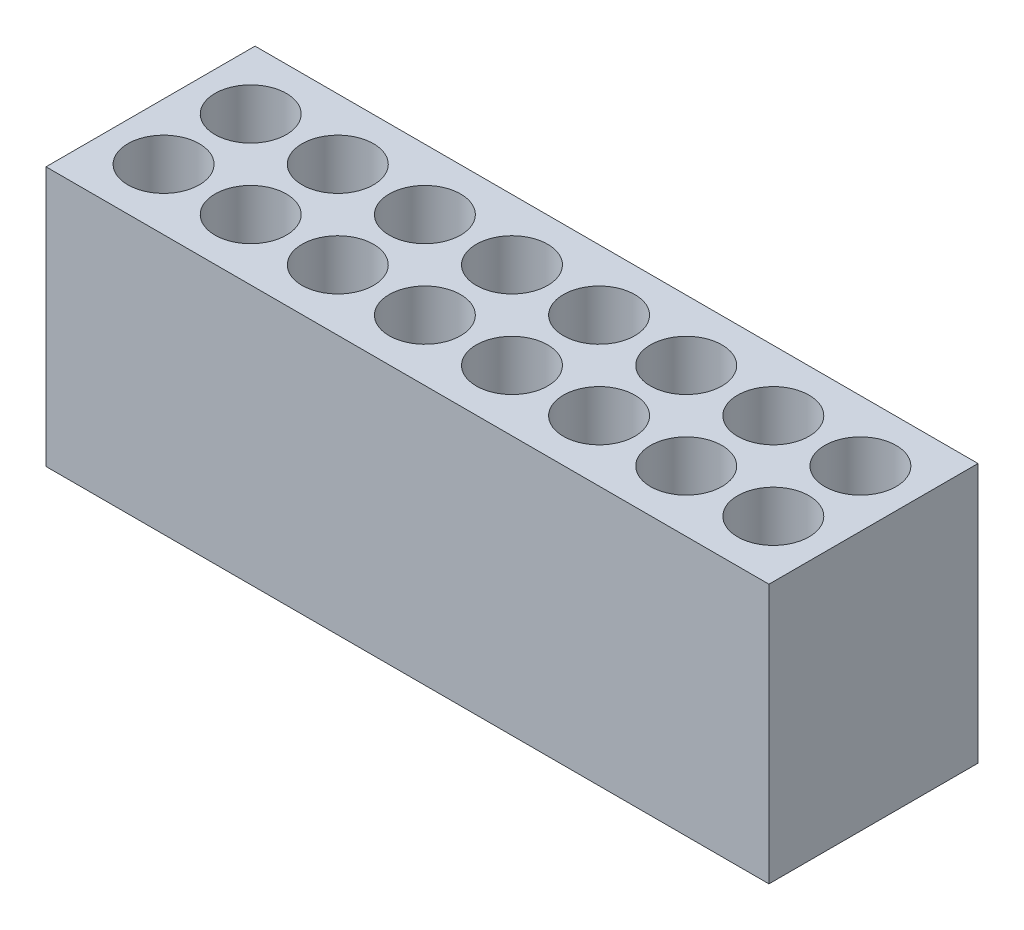
ISO-10303-21;
HEADER;
FILE_DESCRIPTION(('STEP AP214'),'2;1');
FILE_NAME('part.step','',(''),(''),'','','');
FILE_SCHEMA(('AUTOMOTIVE_DESIGN { 1 0 10303 214 1 1 1 1 }'));
ENDSEC;
DATA;
#1=APPLICATION_CONTEXT('core data for automotive mechanical design processes');
#2=APPLICATION_PROTOCOL_DEFINITION('international standard','automotive_design',2000,#1);
#3=PRODUCT_CONTEXT('',#1,'mechanical');
#4=PRODUCT('Part','Part','',(#3));
#5=PRODUCT_RELATED_PRODUCT_CATEGORY('part','',(#4));
#6=PRODUCT_DEFINITION_FORMATION('','',#4);
#7=PRODUCT_DEFINITION_CONTEXT('part definition',#1,'design');
#8=PRODUCT_DEFINITION('design','',#6,#7);
#9=PRODUCT_DEFINITION_SHAPE('','',#8);
#10=(LENGTH_UNIT() NAMED_UNIT(*) SI_UNIT(.MILLI.,.METRE.));
#11=(NAMED_UNIT(*) PLANE_ANGLE_UNIT() SI_UNIT($,.RADIAN.));
#12=(NAMED_UNIT(*) SI_UNIT($,.STERADIAN.) SOLID_ANGLE_UNIT());
#13=UNCERTAINTY_MEASURE_WITH_UNIT(LENGTH_MEASURE(1.E-05),#10,'distance_accuracy_value','');
#14=(GEOMETRIC_REPRESENTATION_CONTEXT(3) GLOBAL_UNCERTAINTY_ASSIGNED_CONTEXT((#13)) GLOBAL_UNIT_ASSIGNED_CONTEXT((#10,
#11,#12)) REPRESENTATION_CONTEXT('',''));
#15=CARTESIAN_POINT('',(0.,0.,0.));
#16=DIRECTION('',(0.,0.,1.));
#17=DIRECTION('',(1.,0.,0.));
#18=AXIS2_PLACEMENT_3D('',#15,#16,#17);
#19=CARTESIAN_POINT('',(0.,-3.7846,-3.048));
#20=DIRECTION('',(-1.,0.,0.));
#21=DIRECTION('',(0.,0.,1.));
#22=AXIS2_PLACEMENT_3D('',#19,#20,#21);
#23=PLANE('',#22);
#24=DIRECTION('',(0.,0.,1.));
#25=VECTOR('',#24,1.);
#26=CARTESIAN_POINT('',(0.,0.,-3.048));
#27=LINE('',#26,#25);
#28=CARTESIAN_POINT('',(0.,0.,-3.048));
#29=VERTEX_POINT('',#28);
#30=CARTESIAN_POINT('',(0.,0.,0.));
#31=VERTEX_POINT('',#30);
#32=EDGE_CURVE('E82',#29,#31,#27,.T.);
#33=ORIENTED_EDGE('',*,*,#32,.F.);
#34=DIRECTION('',(0.,1.,0.));
#35=VECTOR('',#34,1.);
#36=CARTESIAN_POINT('',(0.,-3.7846,-3.048));
#37=LINE('',#36,#35);
#38=CARTESIAN_POINT('',(0.,-3.7846,-3.048));
#39=VERTEX_POINT('',#38);
#40=EDGE_CURVE('E11',#39,#29,#37,.T.);
#41=ORIENTED_EDGE('',*,*,#40,.F.);
#42=DIRECTION('',(0.,0.,1.));
#43=VECTOR('',#42,1.);
#44=CARTESIAN_POINT('',(0.,-3.7846,-3.048));
#45=LINE('',#44,#43);
#46=CARTESIAN_POINT('',(0.,-3.7846,0.));
#47=VERTEX_POINT('',#46);
#48=EDGE_CURVE('E75',#39,#47,#45,.T.);
#49=ORIENTED_EDGE('',*,*,#48,.T.);
#50=DIRECTION('',(0.,1.,0.));
#51=VECTOR('',#50,1.);
#52=CARTESIAN_POINT('',(0.,-3.7846,0.));
#53=LINE('',#52,#51);
#54=EDGE_CURVE('E20',#47,#31,#53,.T.);
#55=ORIENTED_EDGE('',*,*,#54,.T.);
#56=EDGE_LOOP('',(#33,#41,#49,#55));
#57=FACE_BOUND('',#56,.T.);
#58=ADVANCED_FACE('F17',(#57),#23,.T.);
#59=CARTESIAN_POINT('',(10.541,-3.7846,-3.04799999999999));
#60=DIRECTION('',(0.,0.,-1.));
#61=DIRECTION('',(-1.,0.,0.));
#62=AXIS2_PLACEMENT_3D('',#59,#60,#61);
#63=PLANE('',#62);
#64=DIRECTION('',(-1.,0.,0.));
#65=VECTOR('',#64,1.);
#66=CARTESIAN_POINT('',(10.541,0.,-3.04799999999999));
#67=LINE('',#66,#65);
#68=CARTESIAN_POINT('',(10.541,0.,-3.04799999999999));
#69=VERTEX_POINT('',#68);
#70=EDGE_CURVE('E77',#69,#29,#67,.T.);
#71=ORIENTED_EDGE('',*,*,#70,.F.);
#72=DIRECTION('',(0.,1.,0.));
#73=VECTOR('',#72,1.);
#74=CARTESIAN_POINT('',(10.541,-3.7846,-3.04799999999999));
#75=LINE('',#74,#73);
#76=CARTESIAN_POINT('',(10.541,-3.7846,-3.04799999999999));
#77=VERTEX_POINT('',#76);
#78=EDGE_CURVE('E26',#77,#69,#75,.T.);
#79=ORIENTED_EDGE('',*,*,#78,.F.);
#80=DIRECTION('',(-1.,0.,0.));
#81=VECTOR('',#80,1.);
#82=CARTESIAN_POINT('',(10.541,-3.7846,-3.04799999999999));
#83=LINE('',#82,#81);
#84=EDGE_CURVE('E72',#77,#39,#83,.T.);
#85=ORIENTED_EDGE('',*,*,#84,.T.);
#86=ORIENTED_EDGE('',*,*,#40,.T.);
#87=EDGE_LOOP('',(#71,#79,#85,#86));
#88=FACE_BOUND('',#87,.T.);
#89=ADVANCED_FACE('F93',(#88),#63,.T.);
#90=CARTESIAN_POINT('',(10.541,-3.7846,0.));
#91=DIRECTION('',(1.,0.,0.));
#92=DIRECTION('',(0.,0.,-1.));
#93=AXIS2_PLACEMENT_3D('',#90,#91,#92);
#94=PLANE('',#93);
#95=DIRECTION('',(0.,0.,-1.));
#96=VECTOR('',#95,1.);
#97=CARTESIAN_POINT('',(10.541,0.,0.));
#98=LINE('',#97,#96);
#99=CARTESIAN_POINT('',(10.541,0.,0.));
#100=VERTEX_POINT('',#99);
#101=EDGE_CURVE('E67',#100,#69,#98,.T.);
#102=ORIENTED_EDGE('',*,*,#101,.F.);
#103=DIRECTION('',(0.,1.,0.));
#104=VECTOR('',#103,1.);
#105=CARTESIAN_POINT('',(10.541,-3.7846,0.));
#106=LINE('',#105,#104);
#107=CARTESIAN_POINT('',(10.541,-3.7846,0.));
#108=VERTEX_POINT('',#107);
#109=EDGE_CURVE('E62',#108,#100,#106,.T.);
#110=ORIENTED_EDGE('',*,*,#109,.F.);
#111=DIRECTION('',(0.,0.,-1.));
#112=VECTOR('',#111,1.);
#113=CARTESIAN_POINT('',(10.541,-3.7846,0.));
#114=LINE('',#113,#112);
#115=EDGE_CURVE('E65',#108,#77,#114,.T.);
#116=ORIENTED_EDGE('',*,*,#115,.T.);
#117=ORIENTED_EDGE('',*,*,#78,.T.);
#118=EDGE_LOOP('',(#102,#110,#116,#117));
#119=FACE_BOUND('',#118,.T.);
#120=ADVANCED_FACE('F64',(#119),#94,.T.);
#121=CARTESIAN_POINT('',(0.,-3.7846,0.));
#122=DIRECTION('',(0.,0.,1.));
#123=DIRECTION('',(1.,0.,0.));
#124=AXIS2_PLACEMENT_3D('',#121,#122,#123);
#125=PLANE('',#124);
#126=DIRECTION('',(1.,0.,0.));
#127=VECTOR('',#126,1.);
#128=CARTESIAN_POINT('',(0.,0.,0.));
#129=LINE('',#128,#127);
#130=EDGE_CURVE('E85',#31,#100,#129,.T.);
#131=ORIENTED_EDGE('',*,*,#130,.F.);
#132=ORIENTED_EDGE('',*,*,#54,.F.);
#133=DIRECTION('',(1.,0.,0.));
#134=VECTOR('',#133,1.);
#135=CARTESIAN_POINT('',(0.,-3.7846,0.));
#136=LINE('',#135,#134);
#137=EDGE_CURVE('E71',#47,#108,#136,.T.);
#138=ORIENTED_EDGE('',*,*,#137,.T.);
#139=ORIENTED_EDGE('',*,*,#109,.T.);
#140=EDGE_LOOP('',(#131,#132,#138,#139));
#141=FACE_BOUND('',#140,.T.);
#142=ADVANCED_FACE('F74',(#141),#125,.T.);
#143=CARTESIAN_POINT('',(0.,-3.7846,0.));
#144=DIRECTION('',(0.,1.,0.));
#145=DIRECTION('',(0.,0.,1.));
#146=AXIS2_PLACEMENT_3D('',#143,#144,#145);
#147=PLANE('',#146);
#148=CARTESIAN_POINT('',(9.7155,-3.7846,-2.159));
#149=DIRECTION('',(0.,1.,0.));
#150=DIRECTION('',(0.,0.,1.));
#151=AXIS2_PLACEMENT_3D('',#148,#149,#150);
#152=CIRCLE('',#151,0.520700000000013);
#153=CARTESIAN_POINT('',(9.7155,-3.7846,-1.63829999999999));
#154=VERTEX_POINT('',#153);
#155=EDGE_CURVE('E183',#154,#154,#152,.T.);
#156=ORIENTED_EDGE('',*,*,#155,.T.);
#157=EDGE_LOOP('',(#156));
#158=FACE_BOUND('',#157,.T.);
#159=CARTESIAN_POINT('',(8.4455,-3.7846,-2.159));
#160=DIRECTION('',(0.,1.,0.));
#161=DIRECTION('',(0.,0.,1.));
#162=AXIS2_PLACEMENT_3D('',#159,#160,#161);
#163=CIRCLE('',#162,0.520700000000013);
#164=CARTESIAN_POINT('',(8.4455,-3.7846,-1.63829999999999));
#165=VERTEX_POINT('',#164);
#166=EDGE_CURVE('E187',#165,#165,#163,.T.);
#167=ORIENTED_EDGE('',*,*,#166,.T.);
#168=EDGE_LOOP('',(#167));
#169=FACE_BOUND('',#168,.T.);
#170=CARTESIAN_POINT('',(7.1755,-3.7846,-2.159));
#171=DIRECTION('',(0.,1.,0.));
#172=DIRECTION('',(0.,0.,1.));
#173=AXIS2_PLACEMENT_3D('',#170,#171,#172);
#174=CIRCLE('',#173,0.520700000000013);
#175=CARTESIAN_POINT('',(7.1755,-3.7846,-1.63829999999999));
#176=VERTEX_POINT('',#175);
#177=EDGE_CURVE('E196',#176,#176,#174,.T.);
#178=ORIENTED_EDGE('',*,*,#177,.T.);
#179=EDGE_LOOP('',(#178));
#180=FACE_BOUND('',#179,.T.);
#181=CARTESIAN_POINT('',(5.9055,-3.7846,-2.159));
#182=DIRECTION('',(0.,1.,0.));
#183=DIRECTION('',(0.,0.,1.));
#184=AXIS2_PLACEMENT_3D('',#181,#182,#183);
#185=CIRCLE('',#184,0.520700000000013);
#186=CARTESIAN_POINT('',(5.9055,-3.7846,-1.63829999999999));
#187=VERTEX_POINT('',#186);
#188=EDGE_CURVE('E202',#187,#187,#185,.T.);
#189=ORIENTED_EDGE('',*,*,#188,.T.);
#190=EDGE_LOOP('',(#189));
#191=FACE_BOUND('',#190,.T.);
#192=CARTESIAN_POINT('',(4.6355,-3.7846,-2.159));
#193=DIRECTION('',(0.,1.,0.));
#194=DIRECTION('',(0.,0.,1.));
#195=AXIS2_PLACEMENT_3D('',#192,#193,#194);
#196=CIRCLE('',#195,0.520700000000013);
#197=CARTESIAN_POINT('',(4.6355,-3.7846,-1.63829999999999));
#198=VERTEX_POINT('',#197);
#199=EDGE_CURVE('E208',#198,#198,#196,.T.);
#200=ORIENTED_EDGE('',*,*,#199,.T.);
#201=EDGE_LOOP('',(#200));
#202=FACE_BOUND('',#201,.T.);
#203=CARTESIAN_POINT('',(3.3655,-3.7846,-2.159));
#204=DIRECTION('',(0.,1.,0.));
#205=DIRECTION('',(0.,0.,1.));
#206=AXIS2_PLACEMENT_3D('',#203,#204,#205);
#207=CIRCLE('',#206,0.520700000000013);
#208=CARTESIAN_POINT('',(3.3655,-3.7846,-1.63829999999999));
#209=VERTEX_POINT('',#208);
#210=EDGE_CURVE('E214',#209,#209,#207,.T.);
#211=ORIENTED_EDGE('',*,*,#210,.T.);
#212=EDGE_LOOP('',(#211));
#213=FACE_BOUND('',#212,.T.);
#214=CARTESIAN_POINT('',(2.0955,-3.7846,-2.159));
#215=DIRECTION('',(0.,1.,0.));
#216=DIRECTION('',(0.,0.,1.));
#217=AXIS2_PLACEMENT_3D('',#214,#215,#216);
#218=CIRCLE('',#217,0.520700000000013);
#219=CARTESIAN_POINT('',(2.0955,-3.7846,-1.63829999999999));
#220=VERTEX_POINT('',#219);
#221=EDGE_CURVE('E220',#220,#220,#218,.T.);
#222=ORIENTED_EDGE('',*,*,#221,.T.);
#223=EDGE_LOOP('',(#222));
#224=FACE_BOUND('',#223,.T.);
#225=CARTESIAN_POINT('',(0.825499999999999,-3.7846,-2.159));
#226=DIRECTION('',(0.,1.,0.));
#227=DIRECTION('',(0.,0.,1.));
#228=AXIS2_PLACEMENT_3D('',#225,#226,#227);
#229=CIRCLE('',#228,0.520700000000013);
#230=CARTESIAN_POINT('',(0.825499999999999,-3.7846,-1.63829999999999));
#231=VERTEX_POINT('',#230);
#232=EDGE_CURVE('E226',#231,#231,#229,.T.);
#233=ORIENTED_EDGE('',*,*,#232,.T.);
#234=EDGE_LOOP('',(#233));
#235=FACE_BOUND('',#234,.T.);
#236=CARTESIAN_POINT('',(9.7155,-3.7846,-0.889));
#237=DIRECTION('',(0.,1.,0.));
#238=DIRECTION('',(0.,0.,1.));
#239=AXIS2_PLACEMENT_3D('',#236,#237,#238);
#240=CIRCLE('',#239,0.520700000000013);
#241=CARTESIAN_POINT('',(9.7155,-3.7846,-0.368299999999987));
#242=VERTEX_POINT('',#241);
#243=EDGE_CURVE('E232',#242,#242,#240,.T.);
#244=ORIENTED_EDGE('',*,*,#243,.T.);
#245=EDGE_LOOP('',(#244));
#246=FACE_BOUND('',#245,.T.);
#247=CARTESIAN_POINT('',(8.4455,-3.7846,-0.889));
#248=DIRECTION('',(0.,1.,0.));
#249=DIRECTION('',(0.,0.,1.));
#250=AXIS2_PLACEMENT_3D('',#247,#248,#249);
#251=CIRCLE('',#250,0.520700000000013);
#252=CARTESIAN_POINT('',(8.4455,-3.7846,-0.368299999999987));
#253=VERTEX_POINT('',#252);
#254=EDGE_CURVE('E238',#253,#253,#251,.T.);
#255=ORIENTED_EDGE('',*,*,#254,.T.);
#256=EDGE_LOOP('',(#255));
#257=FACE_BOUND('',#256,.T.);
#258=CARTESIAN_POINT('',(7.1755,-3.7846,-0.889));
#259=DIRECTION('',(0.,1.,0.));
#260=DIRECTION('',(0.,0.,1.));
#261=AXIS2_PLACEMENT_3D('',#258,#259,#260);
#262=CIRCLE('',#261,0.520700000000013);
#263=CARTESIAN_POINT('',(7.1755,-3.7846,-0.368299999999987));
#264=VERTEX_POINT('',#263);
#265=EDGE_CURVE('E244',#264,#264,#262,.T.);
#266=ORIENTED_EDGE('',*,*,#265,.T.);
#267=EDGE_LOOP('',(#266));
#268=FACE_BOUND('',#267,.T.);
#269=CARTESIAN_POINT('',(5.9055,-3.7846,-0.889));
#270=DIRECTION('',(0.,1.,0.));
#271=DIRECTION('',(0.,0.,1.));
#272=AXIS2_PLACEMENT_3D('',#269,#270,#271);
#273=CIRCLE('',#272,0.520700000000013);
#274=CARTESIAN_POINT('',(5.9055,-3.7846,-0.368299999999987));
#275=VERTEX_POINT('',#274);
#276=EDGE_CURVE('E250',#275,#275,#273,.T.);
#277=ORIENTED_EDGE('',*,*,#276,.T.);
#278=EDGE_LOOP('',(#277));
#279=FACE_BOUND('',#278,.T.);
#280=CARTESIAN_POINT('',(4.6355,-3.7846,-0.889));
#281=DIRECTION('',(0.,1.,0.));
#282=DIRECTION('',(0.,0.,1.));
#283=AXIS2_PLACEMENT_3D('',#280,#281,#282);
#284=CIRCLE('',#283,0.520700000000013);
#285=CARTESIAN_POINT('',(4.6355,-3.7846,-0.368299999999987));
#286=VERTEX_POINT('',#285);
#287=EDGE_CURVE('E256',#286,#286,#284,.T.);
#288=ORIENTED_EDGE('',*,*,#287,.T.);
#289=EDGE_LOOP('',(#288));
#290=FACE_BOUND('',#289,.T.);
#291=CARTESIAN_POINT('',(3.3655,-3.7846,-0.889));
#292=DIRECTION('',(0.,1.,0.));
#293=DIRECTION('',(0.,0.,1.));
#294=AXIS2_PLACEMENT_3D('',#291,#292,#293);
#295=CIRCLE('',#294,0.520700000000013);
#296=CARTESIAN_POINT('',(3.3655,-3.7846,-0.368299999999987));
#297=VERTEX_POINT('',#296);
#298=EDGE_CURVE('E262',#297,#297,#295,.T.);
#299=ORIENTED_EDGE('',*,*,#298,.T.);
#300=EDGE_LOOP('',(#299));
#301=FACE_BOUND('',#300,.T.);
#302=CARTESIAN_POINT('',(2.0955,-3.7846,-0.889));
#303=DIRECTION('',(0.,1.,0.));
#304=DIRECTION('',(0.,0.,1.));
#305=AXIS2_PLACEMENT_3D('',#302,#303,#304);
#306=CIRCLE('',#305,0.520700000000013);
#307=CARTESIAN_POINT('',(2.0955,-3.7846,-0.368299999999987));
#308=VERTEX_POINT('',#307);
#309=EDGE_CURVE('E268',#308,#308,#306,.T.);
#310=ORIENTED_EDGE('',*,*,#309,.T.);
#311=EDGE_LOOP('',(#310));
#312=FACE_BOUND('',#311,.T.);
#313=CARTESIAN_POINT('',(0.8255,-3.7846,-0.889));
#314=DIRECTION('',(0.,1.,0.));
#315=DIRECTION('',(0.,0.,1.));
#316=AXIS2_PLACEMENT_3D('',#313,#314,#315);
#317=CIRCLE('',#316,0.520700000000013);
#318=CARTESIAN_POINT('',(0.8255,-3.7846,-0.368299999999987));
#319=VERTEX_POINT('',#318);
#320=EDGE_CURVE('E86',#319,#319,#317,.T.);
#321=ORIENTED_EDGE('',*,*,#320,.T.);
#322=EDGE_LOOP('',(#321));
#323=FACE_BOUND('',#322,.T.);
#324=ORIENTED_EDGE('',*,*,#48,.F.);
#325=ORIENTED_EDGE('',*,*,#84,.F.);
#326=ORIENTED_EDGE('',*,*,#115,.F.);
#327=ORIENTED_EDGE('',*,*,#137,.F.);
#328=EDGE_LOOP('',(#324,#325,#326,#327));
#329=FACE_BOUND('',#328,.T.);
#330=ADVANCED_FACE('F70',(#158,#169,#180,#191,#202,#213,#224,#235,#246,#257,#268,#279,#290,#301,
#312,#323,#329),#147,.F.);
#331=CARTESIAN_POINT('',(0.,0.,0.));
#332=DIRECTION('',(0.,1.,0.));
#333=DIRECTION('',(0.,0.,1.));
#334=AXIS2_PLACEMENT_3D('',#331,#332,#333);
#335=PLANE('',#334);
#336=CARTESIAN_POINT('',(9.7155,0.,-2.159));
#337=DIRECTION('',(0.,1.,0.));
#338=DIRECTION('',(0.,0.,1.));
#339=AXIS2_PLACEMENT_3D('',#336,#337,#338);
#340=CIRCLE('',#339,0.520700000000013);
#341=CARTESIAN_POINT('',(9.7155,0.,-1.63829999999999));
#342=VERTEX_POINT('',#341);
#343=EDGE_CURVE('E186',#342,#342,#340,.T.);
#344=ORIENTED_EDGE('',*,*,#343,.F.);
#345=EDGE_LOOP('',(#344));
#346=FACE_BOUND('',#345,.T.);
#347=CARTESIAN_POINT('',(8.4455,0.,-2.159));
#348=DIRECTION('',(0.,1.,0.));
#349=DIRECTION('',(0.,0.,1.));
#350=AXIS2_PLACEMENT_3D('',#347,#348,#349);
#351=CIRCLE('',#350,0.520700000000013);
#352=CARTESIAN_POINT('',(8.4455,0.,-1.63829999999999));
#353=VERTEX_POINT('',#352);
#354=EDGE_CURVE('E190',#353,#353,#351,.T.);
#355=ORIENTED_EDGE('',*,*,#354,.F.);
#356=EDGE_LOOP('',(#355));
#357=FACE_BOUND('',#356,.T.);
#358=CARTESIAN_POINT('',(7.1755,0.,-2.159));
#359=DIRECTION('',(0.,1.,0.));
#360=DIRECTION('',(0.,0.,1.));
#361=AXIS2_PLACEMENT_3D('',#358,#359,#360);
#362=CIRCLE('',#361,0.520700000000013);
#363=CARTESIAN_POINT('',(7.1755,0.,-1.63829999999999));
#364=VERTEX_POINT('',#363);
#365=EDGE_CURVE('E199',#364,#364,#362,.T.);
#366=ORIENTED_EDGE('',*,*,#365,.F.);
#367=EDGE_LOOP('',(#366));
#368=FACE_BOUND('',#367,.T.);
#369=CARTESIAN_POINT('',(5.9055,0.,-2.159));
#370=DIRECTION('',(0.,1.,0.));
#371=DIRECTION('',(0.,0.,1.));
#372=AXIS2_PLACEMENT_3D('',#369,#370,#371);
#373=CIRCLE('',#372,0.520700000000013);
#374=CARTESIAN_POINT('',(5.9055,0.,-1.63829999999999));
#375=VERTEX_POINT('',#374);
#376=EDGE_CURVE('E205',#375,#375,#373,.T.);
#377=ORIENTED_EDGE('',*,*,#376,.F.);
#378=EDGE_LOOP('',(#377));
#379=FACE_BOUND('',#378,.T.);
#380=CARTESIAN_POINT('',(4.6355,0.,-2.159));
#381=DIRECTION('',(0.,1.,0.));
#382=DIRECTION('',(0.,0.,1.));
#383=AXIS2_PLACEMENT_3D('',#380,#381,#382);
#384=CIRCLE('',#383,0.520700000000013);
#385=CARTESIAN_POINT('',(4.6355,0.,-1.63829999999999));
#386=VERTEX_POINT('',#385);
#387=EDGE_CURVE('E211',#386,#386,#384,.T.);
#388=ORIENTED_EDGE('',*,*,#387,.F.);
#389=EDGE_LOOP('',(#388));
#390=FACE_BOUND('',#389,.T.);
#391=CARTESIAN_POINT('',(3.3655,0.,-2.159));
#392=DIRECTION('',(0.,1.,0.));
#393=DIRECTION('',(0.,0.,1.));
#394=AXIS2_PLACEMENT_3D('',#391,#392,#393);
#395=CIRCLE('',#394,0.520700000000013);
#396=CARTESIAN_POINT('',(3.3655,0.,-1.63829999999999));
#397=VERTEX_POINT('',#396);
#398=EDGE_CURVE('E217',#397,#397,#395,.T.);
#399=ORIENTED_EDGE('',*,*,#398,.F.);
#400=EDGE_LOOP('',(#399));
#401=FACE_BOUND('',#400,.T.);
#402=CARTESIAN_POINT('',(2.0955,0.,-2.159));
#403=DIRECTION('',(0.,1.,0.));
#404=DIRECTION('',(0.,0.,1.));
#405=AXIS2_PLACEMENT_3D('',#402,#403,#404);
#406=CIRCLE('',#405,0.520700000000013);
#407=CARTESIAN_POINT('',(2.0955,0.,-1.63829999999999));
#408=VERTEX_POINT('',#407);
#409=EDGE_CURVE('E223',#408,#408,#406,.T.);
#410=ORIENTED_EDGE('',*,*,#409,.F.);
#411=EDGE_LOOP('',(#410));
#412=FACE_BOUND('',#411,.T.);
#413=CARTESIAN_POINT('',(0.825499999999999,0.,-2.159));
#414=DIRECTION('',(0.,1.,0.));
#415=DIRECTION('',(0.,0.,1.));
#416=AXIS2_PLACEMENT_3D('',#413,#414,#415);
#417=CIRCLE('',#416,0.520700000000013);
#418=CARTESIAN_POINT('',(0.825499999999999,0.,-1.63829999999999));
#419=VERTEX_POINT('',#418);
#420=EDGE_CURVE('E229',#419,#419,#417,.T.);
#421=ORIENTED_EDGE('',*,*,#420,.F.);
#422=EDGE_LOOP('',(#421));
#423=FACE_BOUND('',#422,.T.);
#424=CARTESIAN_POINT('',(9.7155,0.,-0.889));
#425=DIRECTION('',(0.,1.,0.));
#426=DIRECTION('',(0.,0.,1.));
#427=AXIS2_PLACEMENT_3D('',#424,#425,#426);
#428=CIRCLE('',#427,0.520700000000013);
#429=CARTESIAN_POINT('',(9.7155,0.,-0.368299999999987));
#430=VERTEX_POINT('',#429);
#431=EDGE_CURVE('E235',#430,#430,#428,.T.);
#432=ORIENTED_EDGE('',*,*,#431,.F.);
#433=EDGE_LOOP('',(#432));
#434=FACE_BOUND('',#433,.T.);
#435=CARTESIAN_POINT('',(8.4455,0.,-0.889));
#436=DIRECTION('',(0.,1.,0.));
#437=DIRECTION('',(0.,0.,1.));
#438=AXIS2_PLACEMENT_3D('',#435,#436,#437);
#439=CIRCLE('',#438,0.520700000000013);
#440=CARTESIAN_POINT('',(8.4455,0.,-0.368299999999987));
#441=VERTEX_POINT('',#440);
#442=EDGE_CURVE('E241',#441,#441,#439,.T.);
#443=ORIENTED_EDGE('',*,*,#442,.F.);
#444=EDGE_LOOP('',(#443));
#445=FACE_BOUND('',#444,.T.);
#446=CARTESIAN_POINT('',(7.1755,0.,-0.889));
#447=DIRECTION('',(0.,1.,0.));
#448=DIRECTION('',(0.,0.,1.));
#449=AXIS2_PLACEMENT_3D('',#446,#447,#448);
#450=CIRCLE('',#449,0.520700000000013);
#451=CARTESIAN_POINT('',(7.1755,0.,-0.368299999999987));
#452=VERTEX_POINT('',#451);
#453=EDGE_CURVE('E247',#452,#452,#450,.T.);
#454=ORIENTED_EDGE('',*,*,#453,.F.);
#455=EDGE_LOOP('',(#454));
#456=FACE_BOUND('',#455,.T.);
#457=CARTESIAN_POINT('',(5.9055,0.,-0.889));
#458=DIRECTION('',(0.,1.,0.));
#459=DIRECTION('',(0.,0.,1.));
#460=AXIS2_PLACEMENT_3D('',#457,#458,#459);
#461=CIRCLE('',#460,0.520700000000013);
#462=CARTESIAN_POINT('',(5.9055,0.,-0.368299999999987));
#463=VERTEX_POINT('',#462);
#464=EDGE_CURVE('E253',#463,#463,#461,.T.);
#465=ORIENTED_EDGE('',*,*,#464,.F.);
#466=EDGE_LOOP('',(#465));
#467=FACE_BOUND('',#466,.T.);
#468=CARTESIAN_POINT('',(4.6355,0.,-0.889));
#469=DIRECTION('',(0.,1.,0.));
#470=DIRECTION('',(0.,0.,1.));
#471=AXIS2_PLACEMENT_3D('',#468,#469,#470);
#472=CIRCLE('',#471,0.520700000000013);
#473=CARTESIAN_POINT('',(4.6355,0.,-0.368299999999987));
#474=VERTEX_POINT('',#473);
#475=EDGE_CURVE('E259',#474,#474,#472,.T.);
#476=ORIENTED_EDGE('',*,*,#475,.F.);
#477=EDGE_LOOP('',(#476));
#478=FACE_BOUND('',#477,.T.);
#479=CARTESIAN_POINT('',(3.3655,0.,-0.889));
#480=DIRECTION('',(0.,1.,0.));
#481=DIRECTION('',(0.,0.,1.));
#482=AXIS2_PLACEMENT_3D('',#479,#480,#481);
#483=CIRCLE('',#482,0.520700000000013);
#484=CARTESIAN_POINT('',(3.3655,0.,-0.368299999999987));
#485=VERTEX_POINT('',#484);
#486=EDGE_CURVE('E265',#485,#485,#483,.T.);
#487=ORIENTED_EDGE('',*,*,#486,.F.);
#488=EDGE_LOOP('',(#487));
#489=FACE_BOUND('',#488,.T.);
#490=CARTESIAN_POINT('',(2.0955,0.,-0.889));
#491=DIRECTION('',(0.,1.,0.));
#492=DIRECTION('',(0.,0.,1.));
#493=AXIS2_PLACEMENT_3D('',#490,#491,#492);
#494=CIRCLE('',#493,0.520700000000013);
#495=CARTESIAN_POINT('',(2.0955,0.,-0.368299999999987));
#496=VERTEX_POINT('',#495);
#497=EDGE_CURVE('E271',#496,#496,#494,.T.);
#498=ORIENTED_EDGE('',*,*,#497,.F.);
#499=EDGE_LOOP('',(#498));
#500=FACE_BOUND('',#499,.T.);
#501=CARTESIAN_POINT('',(0.8255,0.,-0.889));
#502=DIRECTION('',(0.,1.,0.));
#503=DIRECTION('',(0.,0.,1.));
#504=AXIS2_PLACEMENT_3D('',#501,#502,#503);
#505=CIRCLE('',#504,0.520700000000013);
#506=CARTESIAN_POINT('',(0.8255,0.,-0.368299999999987));
#507=VERTEX_POINT('',#506);
#508=EDGE_CURVE('E274',#507,#507,#505,.T.);
#509=ORIENTED_EDGE('',*,*,#508,.F.);
#510=EDGE_LOOP('',(#509));
#511=FACE_BOUND('',#510,.T.);
#512=ORIENTED_EDGE('',*,*,#32,.T.);
#513=ORIENTED_EDGE('',*,*,#130,.T.);
#514=ORIENTED_EDGE('',*,*,#101,.T.);
#515=ORIENTED_EDGE('',*,*,#70,.T.);
#516=EDGE_LOOP('',(#512,#513,#514,#515));
#517=FACE_BOUND('',#516,.T.);
#518=ADVANCED_FACE('F92',(#346,#357,#368,#379,#390,#401,#412,#423,#434,#445,#456,#467,#478,#489,
#500,#511,#517),#335,.T.);
#519=CARTESIAN_POINT('',(0.8255,0.,-0.889));
#520=DIRECTION('',(0.,1.,0.));
#521=DIRECTION('',(0.,0.,1.));
#522=AXIS2_PLACEMENT_3D('',#519,#520,#521);
#523=CYLINDRICAL_SURFACE('',#522,0.520700000000013);
#524=ORIENTED_EDGE('',*,*,#320,.F.);
#525=EDGE_LOOP('',(#524));
#526=FACE_BOUND('',#525,.T.);
#527=ORIENTED_EDGE('',*,*,#508,.T.);
#528=EDGE_LOOP('',(#527));
#529=FACE_BOUND('',#528,.T.);
#530=ADVANCED_FACE('F112',(#526,#529),#523,.F.);
#531=CARTESIAN_POINT('',(2.0955,0.,-0.889));
#532=DIRECTION('',(0.,1.,0.));
#533=DIRECTION('',(0.,0.,1.));
#534=AXIS2_PLACEMENT_3D('',#531,#532,#533);
#535=CYLINDRICAL_SURFACE('',#534,0.520700000000013);
#536=ORIENTED_EDGE('',*,*,#309,.F.);
#537=EDGE_LOOP('',(#536));
#538=FACE_BOUND('',#537,.T.);
#539=ORIENTED_EDGE('',*,*,#497,.T.);
#540=EDGE_LOOP('',(#539));
#541=FACE_BOUND('',#540,.T.);
#542=ADVANCED_FACE('F119',(#538,#541),#535,.F.);
#543=CARTESIAN_POINT('',(3.3655,0.,-0.889));
#544=DIRECTION('',(0.,1.,0.));
#545=DIRECTION('',(0.,0.,1.));
#546=AXIS2_PLACEMENT_3D('',#543,#544,#545);
#547=CYLINDRICAL_SURFACE('',#546,0.520700000000013);
#548=ORIENTED_EDGE('',*,*,#298,.F.);
#549=EDGE_LOOP('',(#548));
#550=FACE_BOUND('',#549,.T.);
#551=ORIENTED_EDGE('',*,*,#486,.T.);
#552=EDGE_LOOP('',(#551));
#553=FACE_BOUND('',#552,.T.);
#554=ADVANCED_FACE('F123',(#550,#553),#547,.F.);
#555=CARTESIAN_POINT('',(4.6355,0.,-0.889));
#556=DIRECTION('',(0.,1.,0.));
#557=DIRECTION('',(0.,0.,1.));
#558=AXIS2_PLACEMENT_3D('',#555,#556,#557);
#559=CYLINDRICAL_SURFACE('',#558,0.520700000000013);
#560=ORIENTED_EDGE('',*,*,#287,.F.);
#561=EDGE_LOOP('',(#560));
#562=FACE_BOUND('',#561,.T.);
#563=ORIENTED_EDGE('',*,*,#475,.T.);
#564=EDGE_LOOP('',(#563));
#565=FACE_BOUND('',#564,.T.);
#566=ADVANCED_FACE('F127',(#562,#565),#559,.F.);
#567=CARTESIAN_POINT('',(5.9055,0.,-0.889));
#568=DIRECTION('',(0.,1.,0.));
#569=DIRECTION('',(0.,0.,1.));
#570=AXIS2_PLACEMENT_3D('',#567,#568,#569);
#571=CYLINDRICAL_SURFACE('',#570,0.520700000000013);
#572=ORIENTED_EDGE('',*,*,#276,.F.);
#573=EDGE_LOOP('',(#572));
#574=FACE_BOUND('',#573,.T.);
#575=ORIENTED_EDGE('',*,*,#464,.T.);
#576=EDGE_LOOP('',(#575));
#577=FACE_BOUND('',#576,.T.);
#578=ADVANCED_FACE('F131',(#574,#577),#571,.F.);
#579=CARTESIAN_POINT('',(7.1755,0.,-0.889));
#580=DIRECTION('',(0.,1.,0.));
#581=DIRECTION('',(0.,0.,1.));
#582=AXIS2_PLACEMENT_3D('',#579,#580,#581);
#583=CYLINDRICAL_SURFACE('',#582,0.520700000000013);
#584=ORIENTED_EDGE('',*,*,#265,.F.);
#585=EDGE_LOOP('',(#584));
#586=FACE_BOUND('',#585,.T.);
#587=ORIENTED_EDGE('',*,*,#453,.T.);
#588=EDGE_LOOP('',(#587));
#589=FACE_BOUND('',#588,.T.);
#590=ADVANCED_FACE('F135',(#586,#589),#583,.F.);
#591=CARTESIAN_POINT('',(8.4455,0.,-0.889));
#592=DIRECTION('',(0.,1.,0.));
#593=DIRECTION('',(0.,0.,1.));
#594=AXIS2_PLACEMENT_3D('',#591,#592,#593);
#595=CYLINDRICAL_SURFACE('',#594,0.520700000000013);
#596=ORIENTED_EDGE('',*,*,#254,.F.);
#597=EDGE_LOOP('',(#596));
#598=FACE_BOUND('',#597,.T.);
#599=ORIENTED_EDGE('',*,*,#442,.T.);
#600=EDGE_LOOP('',(#599));
#601=FACE_BOUND('',#600,.T.);
#602=ADVANCED_FACE('F139',(#598,#601),#595,.F.);
#603=CARTESIAN_POINT('',(9.7155,0.,-0.889));
#604=DIRECTION('',(0.,1.,0.));
#605=DIRECTION('',(0.,0.,1.));
#606=AXIS2_PLACEMENT_3D('',#603,#604,#605);
#607=CYLINDRICAL_SURFACE('',#606,0.520700000000013);
#608=ORIENTED_EDGE('',*,*,#243,.F.);
#609=EDGE_LOOP('',(#608));
#610=FACE_BOUND('',#609,.T.);
#611=ORIENTED_EDGE('',*,*,#431,.T.);
#612=EDGE_LOOP('',(#611));
#613=FACE_BOUND('',#612,.T.);
#614=ADVANCED_FACE('F143',(#610,#613),#607,.F.);
#615=CARTESIAN_POINT('',(0.825499999999999,0.,-2.159));
#616=DIRECTION('',(0.,1.,0.));
#617=DIRECTION('',(0.,0.,1.));
#618=AXIS2_PLACEMENT_3D('',#615,#616,#617);
#619=CYLINDRICAL_SURFACE('',#618,0.520700000000013);
#620=ORIENTED_EDGE('',*,*,#232,.F.);
#621=EDGE_LOOP('',(#620));
#622=FACE_BOUND('',#621,.T.);
#623=ORIENTED_EDGE('',*,*,#420,.T.);
#624=EDGE_LOOP('',(#623));
#625=FACE_BOUND('',#624,.T.);
#626=ADVANCED_FACE('F147',(#622,#625),#619,.F.);
#627=CARTESIAN_POINT('',(2.0955,0.,-2.159));
#628=DIRECTION('',(0.,1.,0.));
#629=DIRECTION('',(0.,0.,1.));
#630=AXIS2_PLACEMENT_3D('',#627,#628,#629);
#631=CYLINDRICAL_SURFACE('',#630,0.520700000000013);
#632=ORIENTED_EDGE('',*,*,#221,.F.);
#633=EDGE_LOOP('',(#632));
#634=FACE_BOUND('',#633,.T.);
#635=ORIENTED_EDGE('',*,*,#409,.T.);
#636=EDGE_LOOP('',(#635));
#637=FACE_BOUND('',#636,.T.);
#638=ADVANCED_FACE('F151',(#634,#637),#631,.F.);
#639=CARTESIAN_POINT('',(3.3655,0.,-2.159));
#640=DIRECTION('',(0.,1.,0.));
#641=DIRECTION('',(0.,0.,1.));
#642=AXIS2_PLACEMENT_3D('',#639,#640,#641);
#643=CYLINDRICAL_SURFACE('',#642,0.520700000000013);
#644=ORIENTED_EDGE('',*,*,#210,.F.);
#645=EDGE_LOOP('',(#644));
#646=FACE_BOUND('',#645,.T.);
#647=ORIENTED_EDGE('',*,*,#398,.T.);
#648=EDGE_LOOP('',(#647));
#649=FACE_BOUND('',#648,.T.);
#650=ADVANCED_FACE('F155',(#646,#649),#643,.F.);
#651=CARTESIAN_POINT('',(4.6355,0.,-2.159));
#652=DIRECTION('',(0.,1.,0.));
#653=DIRECTION('',(0.,0.,1.));
#654=AXIS2_PLACEMENT_3D('',#651,#652,#653);
#655=CYLINDRICAL_SURFACE('',#654,0.520700000000013);
#656=ORIENTED_EDGE('',*,*,#199,.F.);
#657=EDGE_LOOP('',(#656));
#658=FACE_BOUND('',#657,.T.);
#659=ORIENTED_EDGE('',*,*,#387,.T.);
#660=EDGE_LOOP('',(#659));
#661=FACE_BOUND('',#660,.T.);
#662=ADVANCED_FACE('F159',(#658,#661),#655,.F.);
#663=CARTESIAN_POINT('',(5.9055,0.,-2.159));
#664=DIRECTION('',(0.,1.,0.));
#665=DIRECTION('',(0.,0.,1.));
#666=AXIS2_PLACEMENT_3D('',#663,#664,#665);
#667=CYLINDRICAL_SURFACE('',#666,0.520700000000013);
#668=ORIENTED_EDGE('',*,*,#188,.F.);
#669=EDGE_LOOP('',(#668));
#670=FACE_BOUND('',#669,.T.);
#671=ORIENTED_EDGE('',*,*,#376,.T.);
#672=EDGE_LOOP('',(#671));
#673=FACE_BOUND('',#672,.T.);
#674=ADVANCED_FACE('F163',(#670,#673),#667,.F.);
#675=CARTESIAN_POINT('',(7.1755,0.,-2.159));
#676=DIRECTION('',(0.,1.,0.));
#677=DIRECTION('',(0.,0.,1.));
#678=AXIS2_PLACEMENT_3D('',#675,#676,#677);
#679=CYLINDRICAL_SURFACE('',#678,0.520700000000013);
#680=ORIENTED_EDGE('',*,*,#177,.F.);
#681=EDGE_LOOP('',(#680));
#682=FACE_BOUND('',#681,.T.);
#683=ORIENTED_EDGE('',*,*,#365,.T.);
#684=EDGE_LOOP('',(#683));
#685=FACE_BOUND('',#684,.T.);
#686=ADVANCED_FACE('F167',(#682,#685),#679,.F.);
#687=CARTESIAN_POINT('',(8.4455,0.,-2.159));
#688=DIRECTION('',(0.,1.,0.));
#689=DIRECTION('',(0.,0.,1.));
#690=AXIS2_PLACEMENT_3D('',#687,#688,#689);
#691=CYLINDRICAL_SURFACE('',#690,0.520700000000013);
#692=ORIENTED_EDGE('',*,*,#166,.F.);
#693=EDGE_LOOP('',(#692));
#694=FACE_BOUND('',#693,.T.);
#695=ORIENTED_EDGE('',*,*,#354,.T.);
#696=EDGE_LOOP('',(#695));
#697=FACE_BOUND('',#696,.T.);
#698=ADVANCED_FACE('F171',(#694,#697),#691,.F.);
#699=CARTESIAN_POINT('',(9.7155,0.,-2.159));
#700=DIRECTION('',(0.,1.,0.));
#701=DIRECTION('',(0.,0.,1.));
#702=AXIS2_PLACEMENT_3D('',#699,#700,#701);
#703=CYLINDRICAL_SURFACE('',#702,0.520700000000013);
#704=ORIENTED_EDGE('',*,*,#155,.F.);
#705=EDGE_LOOP('',(#704));
#706=FACE_BOUND('',#705,.T.);
#707=ORIENTED_EDGE('',*,*,#343,.T.);
#708=EDGE_LOOP('',(#707));
#709=FACE_BOUND('',#708,.T.);
#710=ADVANCED_FACE('F175',(#706,#709),#703,.F.);
#711=CLOSED_SHELL('',(#58,#89,#120,#142,#330,#518,#530,#542,#554,#566,#578,#590,#602,#614,#626,
#638,#650,#662,#674,#686,#698,#710));
#712=MANIFOLD_SOLID_BREP('B1',#711);
#713=ADVANCED_BREP_SHAPE_REPRESENTATION('',(#18,#712),#14);
#714=SHAPE_DEFINITION_REPRESENTATION(#9,#713);
ENDSEC;
END-ISO-10303-21;
